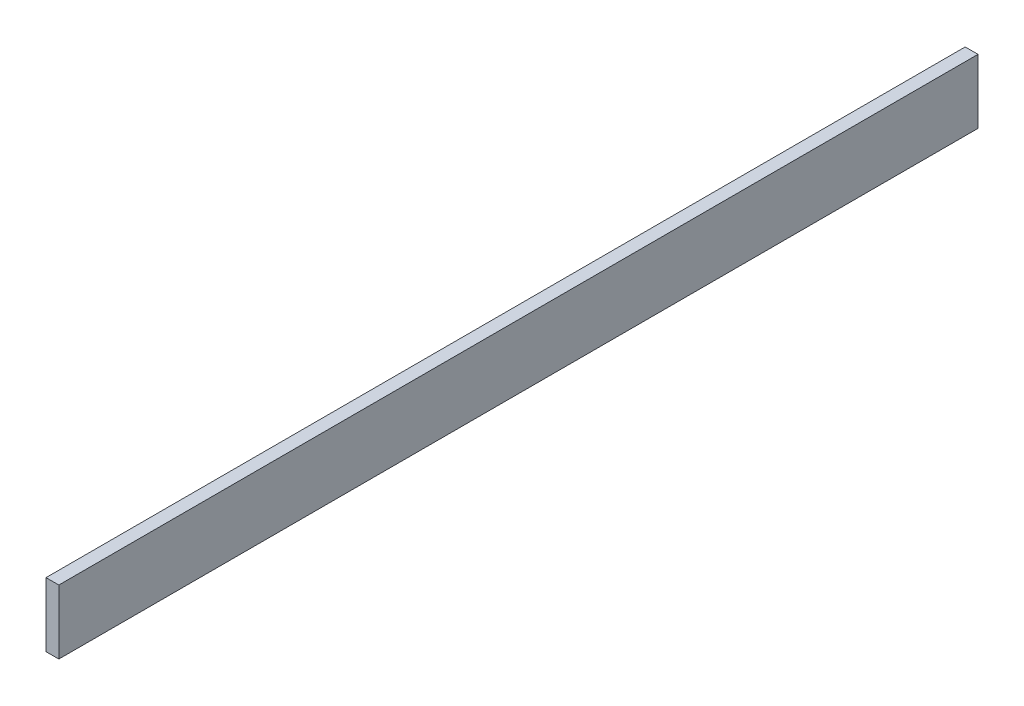
ISO-10303-21;
HEADER;
FILE_DESCRIPTION(('STEP AP214'),'2;1');
FILE_NAME('part.step','',(''),(''),'','','');
FILE_SCHEMA(('AUTOMOTIVE_DESIGN { 1 0 10303 214 1 1 1 1 }'));
ENDSEC;
DATA;
#1=APPLICATION_CONTEXT('core data for automotive mechanical design processes');
#2=APPLICATION_PROTOCOL_DEFINITION('international standard','automotive_design',2000,#1);
#3=PRODUCT_CONTEXT('',#1,'mechanical');
#4=PRODUCT('Part','Part','',(#3));
#5=PRODUCT_RELATED_PRODUCT_CATEGORY('part','',(#4));
#6=PRODUCT_DEFINITION_FORMATION('','',#4);
#7=PRODUCT_DEFINITION_CONTEXT('part definition',#1,'design');
#8=PRODUCT_DEFINITION('design','',#6,#7);
#9=PRODUCT_DEFINITION_SHAPE('','',#8);
#10=(LENGTH_UNIT() NAMED_UNIT(*) SI_UNIT(.MILLI.,.METRE.));
#11=(NAMED_UNIT(*) PLANE_ANGLE_UNIT() SI_UNIT($,.RADIAN.));
#12=(NAMED_UNIT(*) SI_UNIT($,.STERADIAN.) SOLID_ANGLE_UNIT());
#13=UNCERTAINTY_MEASURE_WITH_UNIT(LENGTH_MEASURE(1.E-05),#10,'distance_accuracy_value','');
#14=(GEOMETRIC_REPRESENTATION_CONTEXT(3) GLOBAL_UNCERTAINTY_ASSIGNED_CONTEXT((#13)) GLOBAL_UNIT_ASSIGNED_CONTEXT((#10,
#11,#12)) REPRESENTATION_CONTEXT('',''));
#15=CARTESIAN_POINT('',(0.,0.,0.));
#16=DIRECTION('',(0.,0.,1.));
#17=DIRECTION('',(1.,0.,0.));
#18=AXIS2_PLACEMENT_3D('',#15,#16,#17);
#19=CARTESIAN_POINT('',(3.,-7.5,-107.5));
#20=DIRECTION('',(0.,0.,1.));
#21=DIRECTION('',(1.,0.,0.));
#22=AXIS2_PLACEMENT_3D('',#19,#20,#21);
#23=PLANE('',#22);
#24=DIRECTION('',(0.,1.,0.));
#25=VECTOR('',#24,1.);
#26=CARTESIAN_POINT('',(0.,-7.5,-107.5));
#27=LINE('',#26,#25);
#28=CARTESIAN_POINT('',(0.,-7.5,-107.5));
#29=VERTEX_POINT('',#28);
#30=CARTESIAN_POINT('',(0.,7.5,-107.5));
#31=VERTEX_POINT('',#30);
#32=EDGE_CURVE('E96',#29,#31,#27,.T.);
#33=ORIENTED_EDGE('',*,*,#32,.T.);
#34=DIRECTION('',(-1.,0.,0.));
#35=VECTOR('',#34,1.);
#36=CARTESIAN_POINT('',(3.,7.5,-107.5));
#37=LINE('',#36,#35);
#38=CARTESIAN_POINT('',(3.,7.5,-107.5));
#39=VERTEX_POINT('',#38);
#40=EDGE_CURVE('E11',#39,#31,#37,.T.);
#41=ORIENTED_EDGE('',*,*,#40,.F.);
#42=DIRECTION('',(0.,1.,0.));
#43=VECTOR('',#42,1.);
#44=CARTESIAN_POINT('',(3.,-7.5,-107.5));
#45=LINE('',#44,#43);
#46=CARTESIAN_POINT('',(3.,-7.5,-107.5));
#47=VERTEX_POINT('',#46);
#48=EDGE_CURVE('E84',#47,#39,#45,.T.);
#49=ORIENTED_EDGE('',*,*,#48,.F.);
#50=DIRECTION('',(-1.,0.,0.));
#51=VECTOR('',#50,1.);
#52=CARTESIAN_POINT('',(3.,-7.5,-107.5));
#53=LINE('',#52,#51);
#54=EDGE_CURVE('E92',#47,#29,#53,.T.);
#55=ORIENTED_EDGE('',*,*,#54,.T.);
#56=EDGE_LOOP('',(#33,#41,#49,#55));
#57=FACE_BOUND('',#56,.T.);
#58=ADVANCED_FACE('F33',(#57),#23,.F.);
#59=CARTESIAN_POINT('',(3.,7.5,107.5));
#60=DIRECTION('',(0.,-1.,0.));
#61=DIRECTION('',(0.,0.,-1.));
#62=AXIS2_PLACEMENT_3D('',#59,#60,#61);
#63=PLANE('',#62);
#64=DIRECTION('',(0.,0.,1.));
#65=VECTOR('',#64,1.);
#66=CARTESIAN_POINT('',(0.,7.5,107.5));
#67=LINE('',#66,#65);
#68=CARTESIAN_POINT('',(0.,7.5,107.5));
#69=VERTEX_POINT('',#68);
#70=EDGE_CURVE('E88',#31,#69,#67,.T.);
#71=ORIENTED_EDGE('',*,*,#70,.T.);
#72=DIRECTION('',(-1.,0.,0.));
#73=VECTOR('',#72,1.);
#74=CARTESIAN_POINT('',(3.,7.5,107.5));
#75=LINE('',#74,#73);
#76=CARTESIAN_POINT('',(3.,7.5,107.5));
#77=VERTEX_POINT('',#76);
#78=EDGE_CURVE('E41',#77,#69,#75,.T.);
#79=ORIENTED_EDGE('',*,*,#78,.F.);
#80=DIRECTION('',(0.,0.,1.));
#81=VECTOR('',#80,1.);
#82=CARTESIAN_POINT('',(3.,7.5,107.5));
#83=LINE('',#82,#81);
#84=EDGE_CURVE('E79',#39,#77,#83,.T.);
#85=ORIENTED_EDGE('',*,*,#84,.F.);
#86=ORIENTED_EDGE('',*,*,#40,.T.);
#87=EDGE_LOOP('',(#71,#79,#85,#86));
#88=FACE_BOUND('',#87,.T.);
#89=ADVANCED_FACE('F87',(#88),#63,.F.);
#90=CARTESIAN_POINT('',(3.,-7.5,107.5));
#91=DIRECTION('',(0.,0.,-1.));
#92=DIRECTION('',(-1.,0.,0.));
#93=AXIS2_PLACEMENT_3D('',#90,#91,#92);
#94=PLANE('',#93);
#95=DIRECTION('',(0.,-1.,0.));
#96=VECTOR('',#95,1.);
#97=CARTESIAN_POINT('',(0.,-7.5,107.5));
#98=LINE('',#97,#96);
#99=CARTESIAN_POINT('',(0.,-7.5,107.5));
#100=VERTEX_POINT('',#99);
#101=EDGE_CURVE('E66',#69,#100,#98,.T.);
#102=ORIENTED_EDGE('',*,*,#101,.T.);
#103=DIRECTION('',(-1.,0.,0.));
#104=VECTOR('',#103,1.);
#105=CARTESIAN_POINT('',(3.,-7.5,107.5));
#106=LINE('',#105,#104);
#107=CARTESIAN_POINT('',(3.,-7.5,107.5));
#108=VERTEX_POINT('',#107);
#109=EDGE_CURVE('E89',#108,#100,#106,.T.);
#110=ORIENTED_EDGE('',*,*,#109,.F.);
#111=DIRECTION('',(0.,-1.,0.));
#112=VECTOR('',#111,1.);
#113=CARTESIAN_POINT('',(3.,-7.5,107.5));
#114=LINE('',#113,#112);
#115=EDGE_CURVE('E82',#77,#108,#114,.T.);
#116=ORIENTED_EDGE('',*,*,#115,.F.);
#117=ORIENTED_EDGE('',*,*,#78,.T.);
#118=EDGE_LOOP('',(#102,#110,#116,#117));
#119=FACE_BOUND('',#118,.T.);
#120=ADVANCED_FACE('F90',(#119),#94,.F.);
#121=CARTESIAN_POINT('',(3.,-7.5,107.5));
#122=DIRECTION('',(0.,1.,0.));
#123=DIRECTION('',(0.,0.,1.));
#124=AXIS2_PLACEMENT_3D('',#121,#122,#123);
#125=PLANE('',#124);
#126=DIRECTION('',(0.,0.,-1.));
#127=VECTOR('',#126,1.);
#128=CARTESIAN_POINT('',(0.,-7.5,107.5));
#129=LINE('',#128,#127);
#130=EDGE_CURVE('E72',#100,#29,#129,.T.);
#131=ORIENTED_EDGE('',*,*,#130,.T.);
#132=ORIENTED_EDGE('',*,*,#54,.F.);
#133=DIRECTION('',(0.,0.,-1.));
#134=VECTOR('',#133,1.);
#135=CARTESIAN_POINT('',(3.,-7.5,107.5));
#136=LINE('',#135,#134);
#137=EDGE_CURVE('E49',#108,#47,#136,.T.);
#138=ORIENTED_EDGE('',*,*,#137,.F.);
#139=ORIENTED_EDGE('',*,*,#109,.T.);
#140=EDGE_LOOP('',(#131,#132,#138,#139));
#141=FACE_BOUND('',#140,.T.);
#142=ADVANCED_FACE('F103',(#141),#125,.F.);
#143=CARTESIAN_POINT('',(3.,0.,0.));
#144=DIRECTION('',(-1.,0.,0.));
#145=DIRECTION('',(0.,0.,1.));
#146=AXIS2_PLACEMENT_3D('',#143,#144,#145);
#147=PLANE('',#146);
#148=ORIENTED_EDGE('',*,*,#48,.T.);
#149=ORIENTED_EDGE('',*,*,#84,.T.);
#150=ORIENTED_EDGE('',*,*,#115,.T.);
#151=ORIENTED_EDGE('',*,*,#137,.T.);
#152=EDGE_LOOP('',(#148,#149,#150,#151));
#153=FACE_BOUND('',#152,.T.);
#154=ADVANCED_FACE('F80',(#153),#147,.F.);
#155=CARTESIAN_POINT('',(0.,0.,0.));
#156=DIRECTION('',(-1.,0.,0.));
#157=DIRECTION('',(0.,0.,1.));
#158=AXIS2_PLACEMENT_3D('',#155,#156,#157);
#159=PLANE('',#158);
#160=ORIENTED_EDGE('',*,*,#32,.F.);
#161=ORIENTED_EDGE('',*,*,#130,.F.);
#162=ORIENTED_EDGE('',*,*,#101,.F.);
#163=ORIENTED_EDGE('',*,*,#70,.F.);
#164=EDGE_LOOP('',(#160,#161,#162,#163));
#165=FACE_BOUND('',#164,.T.);
#166=ADVANCED_FACE('F106',(#165),#159,.T.);
#167=CLOSED_SHELL('',(#58,#89,#120,#142,#154,#166));
#168=MANIFOLD_SOLID_BREP('B2',#167);
#169=ADVANCED_BREP_SHAPE_REPRESENTATION('',(#18,#168),#14);
#170=SHAPE_DEFINITION_REPRESENTATION(#9,#169);
ENDSEC;
END-ISO-10303-21;
